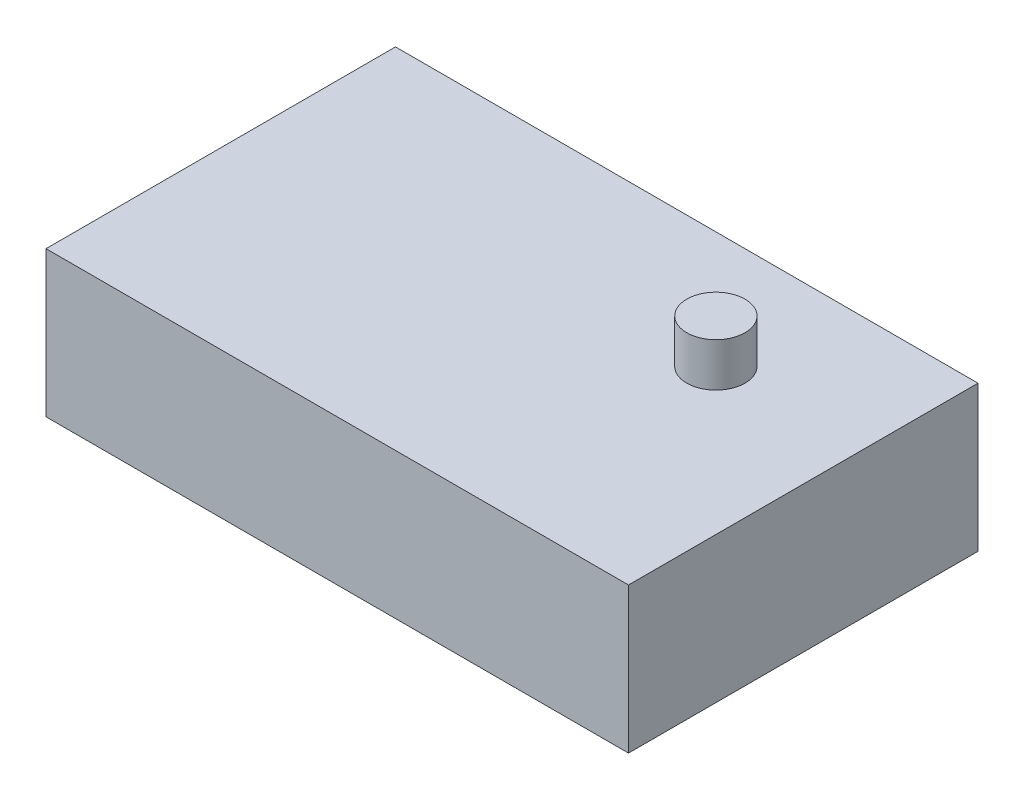
ISO-10303-21;
HEADER;
FILE_DESCRIPTION(('STEP AP214'),'2;1');
FILE_NAME('part.step','',(''),(''),'','','');
FILE_SCHEMA(('AUTOMOTIVE_DESIGN { 1 0 10303 214 1 1 1 1 }'));
ENDSEC;
DATA;
#1=APPLICATION_CONTEXT('core data for automotive mechanical design processes');
#2=APPLICATION_PROTOCOL_DEFINITION('international standard','automotive_design',2000,#1);
#3=PRODUCT_CONTEXT('',#1,'mechanical');
#4=PRODUCT('Part','Part','',(#3));
#5=PRODUCT_RELATED_PRODUCT_CATEGORY('part','',(#4));
#6=PRODUCT_DEFINITION_FORMATION('','',#4);
#7=PRODUCT_DEFINITION_CONTEXT('part definition',#1,'design');
#8=PRODUCT_DEFINITION('design','',#6,#7);
#9=PRODUCT_DEFINITION_SHAPE('','',#8);
#10=(LENGTH_UNIT() NAMED_UNIT(*) SI_UNIT(.MILLI.,.METRE.));
#11=(NAMED_UNIT(*) PLANE_ANGLE_UNIT() SI_UNIT($,.RADIAN.));
#12=(NAMED_UNIT(*) SI_UNIT($,.STERADIAN.) SOLID_ANGLE_UNIT());
#13=UNCERTAINTY_MEASURE_WITH_UNIT(LENGTH_MEASURE(1.E-05),#10,'distance_accuracy_value','');
#14=(GEOMETRIC_REPRESENTATION_CONTEXT(3) GLOBAL_UNCERTAINTY_ASSIGNED_CONTEXT((#13)) GLOBAL_UNIT_ASSIGNED_CONTEXT((#10,
#11,#12)) REPRESENTATION_CONTEXT('',''));
#15=CARTESIAN_POINT('',(0.,0.,0.));
#16=DIRECTION('',(0.,0.,1.));
#17=DIRECTION('',(1.,0.,0.));
#18=AXIS2_PLACEMENT_3D('',#15,#16,#17);
#19=CARTESIAN_POINT('',(-10.,5.,6.));
#20=DIRECTION('',(1.,0.,0.));
#21=DIRECTION('',(0.,0.,-1.));
#22=AXIS2_PLACEMENT_3D('',#19,#20,#21);
#23=PLANE('',#22);
#24=DIRECTION('',(0.,0.,1.));
#25=VECTOR('',#24,1.);
#26=CARTESIAN_POINT('',(-10.,0.,6.));
#27=LINE('',#26,#25);
#28=CARTESIAN_POINT('',(-10.,0.,-6.));
#29=VERTEX_POINT('',#28);
#30=CARTESIAN_POINT('',(-10.,0.,6.));
#31=VERTEX_POINT('',#30);
#32=EDGE_CURVE('E97',#29,#31,#27,.T.);
#33=ORIENTED_EDGE('',*,*,#32,.T.);
#34=DIRECTION('',(0.,-1.,0.));
#35=VECTOR('',#34,1.);
#36=CARTESIAN_POINT('',(-10.,5.,6.));
#37=LINE('',#36,#35);
#38=CARTESIAN_POINT('',(-10.,5.,6.));
#39=VERTEX_POINT('',#38);
#40=EDGE_CURVE('E11',#39,#31,#37,.T.);
#41=ORIENTED_EDGE('',*,*,#40,.F.);
#42=DIRECTION('',(0.,0.,1.));
#43=VECTOR('',#42,1.);
#44=CARTESIAN_POINT('',(-10.,5.,6.));
#45=LINE('',#44,#43);
#46=CARTESIAN_POINT('',(-10.,5.,-6.));
#47=VERTEX_POINT('',#46);
#48=EDGE_CURVE('E85',#47,#39,#45,.T.);
#49=ORIENTED_EDGE('',*,*,#48,.F.);
#50=DIRECTION('',(0.,-1.,0.));
#51=VECTOR('',#50,1.);
#52=CARTESIAN_POINT('',(-10.,5.,-6.));
#53=LINE('',#52,#51);
#54=EDGE_CURVE('E93',#47,#29,#53,.T.);
#55=ORIENTED_EDGE('',*,*,#54,.T.);
#56=EDGE_LOOP('',(#33,#41,#49,#55));
#57=FACE_BOUND('',#56,.T.);
#58=ADVANCED_FACE('F34',(#57),#23,.F.);
#59=CARTESIAN_POINT('',(10.,5.,6.));
#60=DIRECTION('',(0.,0.,-1.));
#61=DIRECTION('',(-1.,0.,0.));
#62=AXIS2_PLACEMENT_3D('',#59,#60,#61);
#63=PLANE('',#62);
#64=DIRECTION('',(1.,0.,0.));
#65=VECTOR('',#64,1.);
#66=CARTESIAN_POINT('',(10.,0.,6.));
#67=LINE('',#66,#65);
#68=CARTESIAN_POINT('',(10.,0.,6.));
#69=VERTEX_POINT('',#68);
#70=EDGE_CURVE('E89',#31,#69,#67,.T.);
#71=ORIENTED_EDGE('',*,*,#70,.T.);
#72=DIRECTION('',(0.,-1.,0.));
#73=VECTOR('',#72,1.);
#74=CARTESIAN_POINT('',(10.,5.,6.));
#75=LINE('',#74,#73);
#76=CARTESIAN_POINT('',(10.,5.,6.));
#77=VERTEX_POINT('',#76);
#78=EDGE_CURVE('E42',#77,#69,#75,.T.);
#79=ORIENTED_EDGE('',*,*,#78,.F.);
#80=DIRECTION('',(1.,0.,0.));
#81=VECTOR('',#80,1.);
#82=CARTESIAN_POINT('',(10.,5.,6.));
#83=LINE('',#82,#81);
#84=EDGE_CURVE('E80',#39,#77,#83,.T.);
#85=ORIENTED_EDGE('',*,*,#84,.F.);
#86=ORIENTED_EDGE('',*,*,#40,.T.);
#87=EDGE_LOOP('',(#71,#79,#85,#86));
#88=FACE_BOUND('',#87,.T.);
#89=ADVANCED_FACE('F88',(#88),#63,.F.);
#90=CARTESIAN_POINT('',(10.,5.,6.));
#91=DIRECTION('',(-1.,0.,0.));
#92=DIRECTION('',(0.,0.,1.));
#93=AXIS2_PLACEMENT_3D('',#90,#91,#92);
#94=PLANE('',#93);
#95=DIRECTION('',(0.,0.,-1.));
#96=VECTOR('',#95,1.);
#97=CARTESIAN_POINT('',(10.,0.,6.));
#98=LINE('',#97,#96);
#99=CARTESIAN_POINT('',(10.,0.,-6.));
#100=VERTEX_POINT('',#99);
#101=EDGE_CURVE('E67',#69,#100,#98,.T.);
#102=ORIENTED_EDGE('',*,*,#101,.T.);
#103=DIRECTION('',(0.,-1.,0.));
#104=VECTOR('',#103,1.);
#105=CARTESIAN_POINT('',(10.,5.,-6.));
#106=LINE('',#105,#104);
#107=CARTESIAN_POINT('',(10.,5.,-6.));
#108=VERTEX_POINT('',#107);
#109=EDGE_CURVE('E90',#108,#100,#106,.T.);
#110=ORIENTED_EDGE('',*,*,#109,.F.);
#111=DIRECTION('',(0.,0.,-1.));
#112=VECTOR('',#111,1.);
#113=CARTESIAN_POINT('',(10.,5.,6.));
#114=LINE('',#113,#112);
#115=EDGE_CURVE('E83',#77,#108,#114,.T.);
#116=ORIENTED_EDGE('',*,*,#115,.F.);
#117=ORIENTED_EDGE('',*,*,#78,.T.);
#118=EDGE_LOOP('',(#102,#110,#116,#117));
#119=FACE_BOUND('',#118,.T.);
#120=ADVANCED_FACE('F91',(#119),#94,.F.);
#121=CARTESIAN_POINT('',(10.,5.,-6.));
#122=DIRECTION('',(0.,0.,1.));
#123=DIRECTION('',(1.,0.,0.));
#124=AXIS2_PLACEMENT_3D('',#121,#122,#123);
#125=PLANE('',#124);
#126=DIRECTION('',(-1.,0.,0.));
#127=VECTOR('',#126,1.);
#128=CARTESIAN_POINT('',(10.,0.,-6.));
#129=LINE('',#128,#127);
#130=EDGE_CURVE('E73',#100,#29,#129,.T.);
#131=ORIENTED_EDGE('',*,*,#130,.T.);
#132=ORIENTED_EDGE('',*,*,#54,.F.);
#133=DIRECTION('',(-1.,0.,0.));
#134=VECTOR('',#133,1.);
#135=CARTESIAN_POINT('',(10.,5.,-6.));
#136=LINE('',#135,#134);
#137=EDGE_CURVE('E50',#108,#47,#136,.T.);
#138=ORIENTED_EDGE('',*,*,#137,.F.);
#139=ORIENTED_EDGE('',*,*,#109,.T.);
#140=EDGE_LOOP('',(#131,#132,#138,#139));
#141=FACE_BOUND('',#140,.T.);
#142=ADVANCED_FACE('F105',(#141),#125,.F.);
#143=CARTESIAN_POINT('',(0.,5.,0.));
#144=DIRECTION('',(0.,1.,0.));
#145=DIRECTION('',(0.,0.,1.));
#146=AXIS2_PLACEMENT_3D('',#143,#144,#145);
#147=PLANE('',#146);
#148=CARTESIAN_POINT('',(5.,5.,-2.));
#149=DIRECTION('',(0.,1.,0.));
#150=DIRECTION('',(0.,0.,1.));
#151=AXIS2_PLACEMENT_3D('',#148,#149,#150);
#152=CIRCLE('',#151,1.);
#153=CARTESIAN_POINT('',(5.,5.,-1.));
#154=VERTEX_POINT('',#153);
#155=EDGE_CURVE('E111',#154,#154,#152,.T.);
#156=ORIENTED_EDGE('',*,*,#155,.F.);
#157=EDGE_LOOP('',(#156));
#158=FACE_BOUND('',#157,.T.);
#159=ORIENTED_EDGE('',*,*,#48,.T.);
#160=ORIENTED_EDGE('',*,*,#84,.T.);
#161=ORIENTED_EDGE('',*,*,#115,.T.);
#162=ORIENTED_EDGE('',*,*,#137,.T.);
#163=EDGE_LOOP('',(#159,#160,#161,#162));
#164=FACE_BOUND('',#163,.T.);
#165=ADVANCED_FACE('F81',(#158,#164),#147,.T.);
#166=CARTESIAN_POINT('',(0.,0.,0.));
#167=DIRECTION('',(0.,1.,0.));
#168=DIRECTION('',(0.,0.,1.));
#169=AXIS2_PLACEMENT_3D('',#166,#167,#168);
#170=PLANE('',#169);
#171=ORIENTED_EDGE('',*,*,#32,.F.);
#172=ORIENTED_EDGE('',*,*,#130,.F.);
#173=ORIENTED_EDGE('',*,*,#101,.F.);
#174=ORIENTED_EDGE('',*,*,#70,.F.);
#175=EDGE_LOOP('',(#171,#172,#173,#174));
#176=FACE_BOUND('',#175,.T.);
#177=ADVANCED_FACE('F108',(#176),#170,.F.);
#178=CARTESIAN_POINT('',(5.,6.5,-2.));
#179=DIRECTION('',(0.,-1.,0.));
#180=DIRECTION('',(0.,0.,-1.));
#181=AXIS2_PLACEMENT_3D('',#178,#179,#180);
#182=CYLINDRICAL_SURFACE('',#181,1.);
#183=CARTESIAN_POINT('',(5.,6.5,-2.));
#184=DIRECTION('',(0.,1.,0.));
#185=DIRECTION('',(0.,0.,1.));
#186=AXIS2_PLACEMENT_3D('',#183,#184,#185);
#187=CIRCLE('',#186,1.);
#188=CARTESIAN_POINT('',(5.,6.5,-1.));
#189=VERTEX_POINT('',#188);
#190=EDGE_CURVE('E100',#189,#189,#187,.T.);
#191=ORIENTED_EDGE('',*,*,#190,.F.);
#192=EDGE_LOOP('',(#191));
#193=FACE_BOUND('',#192,.T.);
#194=ORIENTED_EDGE('',*,*,#155,.T.);
#195=EDGE_LOOP('',(#194));
#196=FACE_BOUND('',#195,.T.);
#197=ADVANCED_FACE('F119',(#193,#196),#182,.T.);
#198=CARTESIAN_POINT('',(5.,6.5,-2.));
#199=DIRECTION('',(0.,1.,0.));
#200=DIRECTION('',(0.,0.,1.));
#201=AXIS2_PLACEMENT_3D('',#198,#199,#200);
#202=PLANE('',#201);
#203=ORIENTED_EDGE('',*,*,#190,.T.);
#204=EDGE_LOOP('',(#203));
#205=FACE_BOUND('',#204,.T.);
#206=ADVANCED_FACE('F117',(#205),#202,.T.);
#207=CLOSED_SHELL('',(#58,#89,#120,#142,#165,#177,#197,#206));
#208=MANIFOLD_SOLID_BREP('B2',#207);
#209=ADVANCED_BREP_SHAPE_REPRESENTATION('',(#18,#208),#14);
#210=SHAPE_DEFINITION_REPRESENTATION(#9,#209);
ENDSEC;
END-ISO-10303-21;
